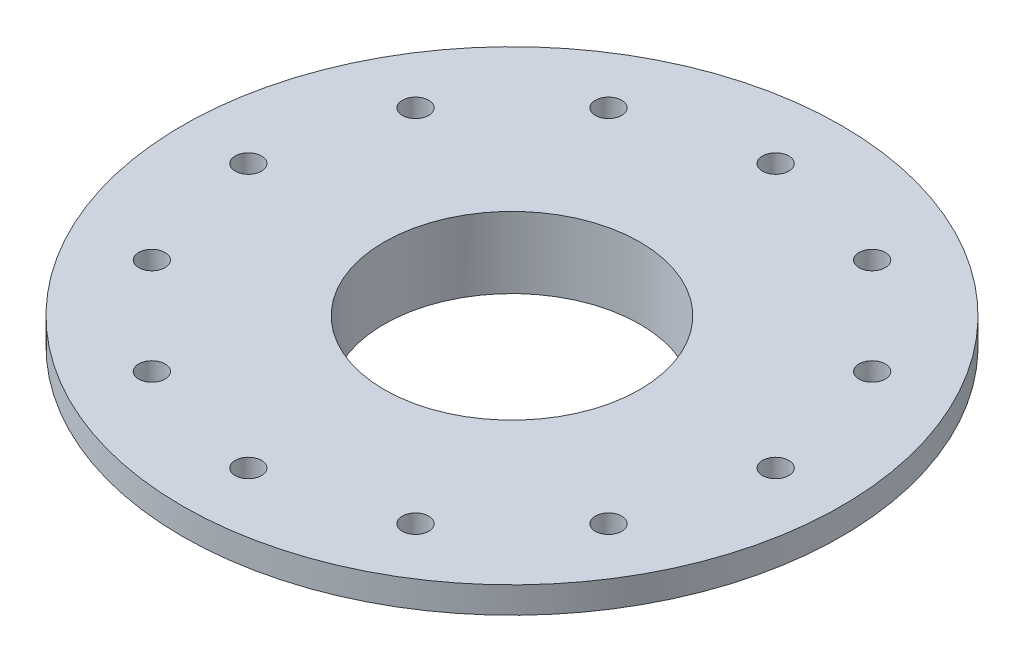
ISO-10303-21;
HEADER;
FILE_DESCRIPTION(('STEP AP214'),'2;1');
FILE_NAME('part.step','',(''),(''),'','','');
FILE_SCHEMA(('AUTOMOTIVE_DESIGN { 1 0 10303 214 1 1 1 1 }'));
ENDSEC;
DATA;
#1=APPLICATION_CONTEXT('core data for automotive mechanical design processes');
#2=APPLICATION_PROTOCOL_DEFINITION('international standard','automotive_design',2000,#1);
#3=PRODUCT_CONTEXT('',#1,'mechanical');
#4=PRODUCT('Part','Part','',(#3));
#5=PRODUCT_RELATED_PRODUCT_CATEGORY('part','',(#4));
#6=PRODUCT_DEFINITION_FORMATION('','',#4);
#7=PRODUCT_DEFINITION_CONTEXT('part definition',#1,'design');
#8=PRODUCT_DEFINITION('design','',#6,#7);
#9=PRODUCT_DEFINITION_SHAPE('','',#8);
#10=(LENGTH_UNIT() NAMED_UNIT(*) SI_UNIT(.MILLI.,.METRE.));
#11=(NAMED_UNIT(*) PLANE_ANGLE_UNIT() SI_UNIT($,.RADIAN.));
#12=(NAMED_UNIT(*) SI_UNIT($,.STERADIAN.) SOLID_ANGLE_UNIT());
#13=UNCERTAINTY_MEASURE_WITH_UNIT(LENGTH_MEASURE(1.E-05),#10,'distance_accuracy_value','');
#14=(GEOMETRIC_REPRESENTATION_CONTEXT(3) GLOBAL_UNCERTAINTY_ASSIGNED_CONTEXT((#13)) GLOBAL_UNIT_ASSIGNED_CONTEXT((#10,
#11,#12)) REPRESENTATION_CONTEXT('',''));
#15=CARTESIAN_POINT('',(0.,0.,0.));
#16=DIRECTION('',(0.,0.,1.));
#17=DIRECTION('',(1.,0.,0.));
#18=AXIS2_PLACEMENT_3D('',#15,#16,#17);
#19=CARTESIAN_POINT('',(0.,10.,0.));
#20=DIRECTION('',(0.,-1.,0.));
#21=DIRECTION('',(0.,0.,-1.));
#22=AXIS2_PLACEMENT_3D('',#19,#20,#21);
#23=CYLINDRICAL_SURFACE('',#22,125.);
#24=CARTESIAN_POINT('',(0.,10.,0.));
#25=DIRECTION('',(0.,1.,0.));
#26=DIRECTION('',(0.,0.,1.));
#27=AXIS2_PLACEMENT_3D('',#24,#25,#26);
#28=CIRCLE('',#27,125.);
#29=CARTESIAN_POINT('',(0.,10.,125.));
#30=VERTEX_POINT('',#29);
#31=EDGE_CURVE('E50',#30,#30,#28,.T.);
#32=ORIENTED_EDGE('',*,*,#31,.F.);
#33=EDGE_LOOP('',(#32));
#34=FACE_BOUND('',#33,.T.);
#35=CARTESIAN_POINT('',(0.,0.,0.));
#36=DIRECTION('',(0.,1.,0.));
#37=DIRECTION('',(0.,0.,1.));
#38=AXIS2_PLACEMENT_3D('',#35,#36,#37);
#39=CIRCLE('',#38,125.);
#40=CARTESIAN_POINT('',(0.,0.,125.));
#41=VERTEX_POINT('',#40);
#42=EDGE_CURVE('E53',#41,#41,#39,.T.);
#43=ORIENTED_EDGE('',*,*,#42,.T.);
#44=EDGE_LOOP('',(#43));
#45=FACE_BOUND('',#44,.T.);
#46=ADVANCED_FACE('F35',(#34,#45),#23,.T.);
#47=CARTESIAN_POINT('',(0.,10.,0.));
#48=DIRECTION('',(0.,1.,0.));
#49=DIRECTION('',(0.,0.,1.));
#50=AXIS2_PLACEMENT_3D('',#47,#48,#49);
#51=PLANE('',#50);
#52=CARTESIAN_POINT('',(0.,10.,0.));
#53=DIRECTION('',(0.,1.,0.));
#54=DIRECTION('',(0.,0.,1.));
#55=AXIS2_PLACEMENT_3D('',#52,#53,#54);
#56=CIRCLE('',#55,48.5);
#57=CARTESIAN_POINT('',(0.,10.,48.5));
#58=VERTEX_POINT('',#57);
#59=EDGE_CURVE('E113',#58,#58,#56,.T.);
#60=ORIENTED_EDGE('',*,*,#59,.F.);
#61=EDGE_LOOP('',(#60));
#62=FACE_BOUND('',#61,.T.);
#63=CARTESIAN_POINT('',(100.,10.,0.));
#64=DIRECTION('',(0.,1.,0.));
#65=DIRECTION('',(0.,0.,1.));
#66=AXIS2_PLACEMENT_3D('',#63,#64,#65);
#67=CIRCLE('',#66,4.99999999999999);
#68=CARTESIAN_POINT('',(100.,10.,4.99999999999999));
#69=VERTEX_POINT('',#68);
#70=EDGE_CURVE('E84',#69,#69,#67,.T.);
#71=ORIENTED_EDGE('',*,*,#70,.F.);
#72=EDGE_LOOP('',(#71));
#73=FACE_BOUND('',#72,.T.);
#74=CARTESIAN_POINT('',(86.6025403784438,10.,-50.0000000000001));
#75=DIRECTION('',(0.,1.,0.));
#76=DIRECTION('',(0.,0.,1.));
#77=AXIS2_PLACEMENT_3D('',#74,#75,#76);
#78=CIRCLE('',#77,4.99999999999999);
#79=CARTESIAN_POINT('',(86.6025403784438,10.,-45.0000000000001));
#80=VERTEX_POINT('',#79);
#81=EDGE_CURVE('E109',#80,#80,#78,.T.);
#82=ORIENTED_EDGE('',*,*,#81,.F.);
#83=EDGE_LOOP('',(#82));
#84=FACE_BOUND('',#83,.T.);
#85=CARTESIAN_POINT('',(49.9999999999999,10.,-86.6025403784439));
#86=DIRECTION('',(0.,1.,0.));
#87=DIRECTION('',(0.,0.,1.));
#88=AXIS2_PLACEMENT_3D('',#85,#86,#87);
#89=CIRCLE('',#88,5.);
#90=CARTESIAN_POINT('',(49.9999999999999,10.,-81.6025403784439));
#91=VERTEX_POINT('',#90);
#92=EDGE_CURVE('E116',#91,#91,#89,.T.);
#93=ORIENTED_EDGE('',*,*,#92,.F.);
#94=EDGE_LOOP('',(#93));
#95=FACE_BOUND('',#94,.T.);
#96=CARTESIAN_POINT('',(0.,10.,-100.));
#97=DIRECTION('',(0.,1.,0.));
#98=DIRECTION('',(0.,0.,1.));
#99=AXIS2_PLACEMENT_3D('',#96,#97,#98);
#100=CIRCLE('',#99,4.99999999999999);
#101=CARTESIAN_POINT('',(0.,10.,-95.));
#102=VERTEX_POINT('',#101);
#103=EDGE_CURVE('E122',#102,#102,#100,.T.);
#104=ORIENTED_EDGE('',*,*,#103,.F.);
#105=EDGE_LOOP('',(#104));
#106=FACE_BOUND('',#105,.T.);
#107=CARTESIAN_POINT('',(86.6025403784439,10.,50.));
#108=DIRECTION('',(0.,1.,0.));
#109=DIRECTION('',(0.,0.,1.));
#110=AXIS2_PLACEMENT_3D('',#107,#108,#109);
#111=CIRCLE('',#110,5.00000000000001);
#112=CARTESIAN_POINT('',(86.6025403784439,10.,55.));
#113=VERTEX_POINT('',#112);
#114=EDGE_CURVE('E78',#113,#113,#111,.T.);
#115=ORIENTED_EDGE('',*,*,#114,.F.);
#116=EDGE_LOOP('',(#115));
#117=FACE_BOUND('',#116,.T.);
#118=CARTESIAN_POINT('',(50.,10.,86.6025403784438));
#119=DIRECTION('',(0.,1.,0.));
#120=DIRECTION('',(0.,0.,1.));
#121=AXIS2_PLACEMENT_3D('',#118,#119,#120);
#122=CIRCLE('',#121,5.00000000000001);
#123=CARTESIAN_POINT('',(50.,10.,91.6025403784439));
#124=VERTEX_POINT('',#123);
#125=EDGE_CURVE('E72',#124,#124,#122,.T.);
#126=ORIENTED_EDGE('',*,*,#125,.F.);
#127=EDGE_LOOP('',(#126));
#128=FACE_BOUND('',#127,.T.);
#129=CARTESIAN_POINT('',(0.,10.,100.));
#130=DIRECTION('',(0.,1.,0.));
#131=DIRECTION('',(0.,0.,1.));
#132=AXIS2_PLACEMENT_3D('',#129,#130,#131);
#133=CIRCLE('',#132,4.99999999999998);
#134=CARTESIAN_POINT('',(0.,10.,105.));
#135=VERTEX_POINT('',#134);
#136=EDGE_CURVE('E66',#135,#135,#133,.T.);
#137=ORIENTED_EDGE('',*,*,#136,.F.);
#138=EDGE_LOOP('',(#137));
#139=FACE_BOUND('',#138,.T.);
#140=CARTESIAN_POINT('',(-50.,10.,86.6025403784439));
#141=DIRECTION('',(0.,1.,0.));
#142=DIRECTION('',(0.,0.,1.));
#143=AXIS2_PLACEMENT_3D('',#140,#141,#142);
#144=CIRCLE('',#143,4.99999999999999);
#145=CARTESIAN_POINT('',(-50.,10.,91.6025403784439));
#146=VERTEX_POINT('',#145);
#147=EDGE_CURVE('E59',#146,#146,#144,.T.);
#148=ORIENTED_EDGE('',*,*,#147,.F.);
#149=EDGE_LOOP('',(#148));
#150=FACE_BOUND('',#149,.T.);
#151=CARTESIAN_POINT('',(-86.6025403784439,10.,50.));
#152=DIRECTION('',(0.,1.,0.));
#153=DIRECTION('',(0.,0.,1.));
#154=AXIS2_PLACEMENT_3D('',#151,#152,#153);
#155=CIRCLE('',#154,4.99999999999999);
#156=CARTESIAN_POINT('',(-86.6025403784439,10.,55.));
#157=VERTEX_POINT('',#156);
#158=EDGE_CURVE('E104',#157,#157,#155,.T.);
#159=ORIENTED_EDGE('',*,*,#158,.F.);
#160=EDGE_LOOP('',(#159));
#161=FACE_BOUND('',#160,.T.);
#162=CARTESIAN_POINT('',(-100.,10.,0.));
#163=DIRECTION('',(0.,1.,0.));
#164=DIRECTION('',(0.,0.,1.));
#165=AXIS2_PLACEMENT_3D('',#162,#163,#164);
#166=CIRCLE('',#165,4.99999999999999);
#167=CARTESIAN_POINT('',(-100.,10.,4.99999999999998));
#168=VERTEX_POINT('',#167);
#169=EDGE_CURVE('E98',#168,#168,#166,.T.);
#170=ORIENTED_EDGE('',*,*,#169,.F.);
#171=EDGE_LOOP('',(#170));
#172=FACE_BOUND('',#171,.T.);
#173=CARTESIAN_POINT('',(-86.6025403784439,10.,-50.));
#174=DIRECTION('',(0.,1.,0.));
#175=DIRECTION('',(0.,0.,1.));
#176=AXIS2_PLACEMENT_3D('',#173,#174,#175);
#177=CIRCLE('',#176,4.99999999999999);
#178=CARTESIAN_POINT('',(-86.6025403784439,10.,-45.));
#179=VERTEX_POINT('',#178);
#180=EDGE_CURVE('E92',#179,#179,#177,.T.);
#181=ORIENTED_EDGE('',*,*,#180,.F.);
#182=EDGE_LOOP('',(#181));
#183=FACE_BOUND('',#182,.T.);
#184=CARTESIAN_POINT('',(-50.,10.,-86.6025403784439));
#185=DIRECTION('',(0.,1.,0.));
#186=DIRECTION('',(0.,0.,1.));
#187=AXIS2_PLACEMENT_3D('',#184,#185,#186);
#188=CIRCLE('',#187,4.99999999999999);
#189=CARTESIAN_POINT('',(-50.,10.,-81.6025403784439));
#190=VERTEX_POINT('',#189);
#191=EDGE_CURVE('E85',#190,#190,#188,.T.);
#192=ORIENTED_EDGE('',*,*,#191,.F.);
#193=EDGE_LOOP('',(#192));
#194=FACE_BOUND('',#193,.T.);
#195=ORIENTED_EDGE('',*,*,#31,.T.);
#196=EDGE_LOOP('',(#195));
#197=FACE_BOUND('',#196,.T.);
#198=ADVANCED_FACE('F156',(#62,#73,#84,#95,#106,#117,#128,#139,#150,#161,#172,#183,#194,#197),
#51,.T.);
#199=CARTESIAN_POINT('',(0.,0.,0.));
#200=DIRECTION('',(0.,1.,0.));
#201=DIRECTION('',(0.,0.,1.));
#202=AXIS2_PLACEMENT_3D('',#199,#200,#201);
#203=PLANE('',#202);
#204=CARTESIAN_POINT('',(0.,0.,0.));
#205=DIRECTION('',(0.,-1.,0.));
#206=DIRECTION('',(0.,0.,-1.));
#207=AXIS2_PLACEMENT_3D('',#204,#205,#206);
#208=CIRCLE('',#207,107.5);
#209=CARTESIAN_POINT('',(0.,0.,-107.5));
#210=VERTEX_POINT('',#209);
#211=EDGE_CURVE('E46',#210,#210,#208,.T.);
#212=ORIENTED_EDGE('',*,*,#211,.F.);
#213=EDGE_LOOP('',(#212));
#214=FACE_BOUND('',#213,.T.);
#215=ORIENTED_EDGE('',*,*,#42,.F.);
#216=EDGE_LOOP('',(#215));
#217=FACE_BOUND('',#216,.T.);
#218=ADVANCED_FACE('F161',(#214,#217),#203,.F.);
#219=CARTESIAN_POINT('',(-50.,0.,-86.6025403784439));
#220=DIRECTION('',(0.,1.,0.));
#221=DIRECTION('',(0.,0.,1.));
#222=AXIS2_PLACEMENT_3D('',#219,#220,#221);
#223=CYLINDRICAL_SURFACE('',#222,4.99999999999999);
#224=CARTESIAN_POINT('',(-50.,0.,-86.6025403784439));
#225=DIRECTION('',(0.,1.,0.));
#226=DIRECTION('',(0.,0.,1.));
#227=AXIS2_PLACEMENT_3D('',#224,#225,#226);
#228=CIRCLE('',#227,4.99999999999999);
#229=CARTESIAN_POINT('',(-50.,0.,-81.6025403784439));
#230=VERTEX_POINT('',#229);
#231=EDGE_CURVE('E88',#230,#230,#228,.T.);
#232=ORIENTED_EDGE('',*,*,#231,.F.);
#233=EDGE_LOOP('',(#232));
#234=FACE_BOUND('',#233,.T.);
#235=ORIENTED_EDGE('',*,*,#191,.T.);
#236=EDGE_LOOP('',(#235));
#237=FACE_BOUND('',#236,.T.);
#238=ADVANCED_FACE('F168',(#234,#237),#223,.F.);
#239=CARTESIAN_POINT('',(-86.6025403784439,0.,-50.));
#240=DIRECTION('',(0.,1.,0.));
#241=DIRECTION('',(0.,0.,1.));
#242=AXIS2_PLACEMENT_3D('',#239,#240,#241);
#243=CYLINDRICAL_SURFACE('',#242,4.99999999999999);
#244=CARTESIAN_POINT('',(-86.6025403784439,0.,-50.));
#245=DIRECTION('',(0.,1.,0.));
#246=DIRECTION('',(0.,0.,1.));
#247=AXIS2_PLACEMENT_3D('',#244,#245,#246);
#248=CIRCLE('',#247,4.99999999999999);
#249=CARTESIAN_POINT('',(-86.6025403784439,0.,-45.));
#250=VERTEX_POINT('',#249);
#251=EDGE_CURVE('E95',#250,#250,#248,.T.);
#252=ORIENTED_EDGE('',*,*,#251,.F.);
#253=EDGE_LOOP('',(#252));
#254=FACE_BOUND('',#253,.T.);
#255=ORIENTED_EDGE('',*,*,#180,.T.);
#256=EDGE_LOOP('',(#255));
#257=FACE_BOUND('',#256,.T.);
#258=ADVANCED_FACE('F191',(#254,#257),#243,.F.);
#259=CARTESIAN_POINT('',(-100.,0.,0.));
#260=DIRECTION('',(0.,1.,0.));
#261=DIRECTION('',(0.,0.,1.));
#262=AXIS2_PLACEMENT_3D('',#259,#260,#261);
#263=CYLINDRICAL_SURFACE('',#262,4.99999999999999);
#264=CARTESIAN_POINT('',(-100.,0.,0.));
#265=DIRECTION('',(0.,1.,0.));
#266=DIRECTION('',(0.,0.,1.));
#267=AXIS2_PLACEMENT_3D('',#264,#265,#266);
#268=CIRCLE('',#267,4.99999999999999);
#269=CARTESIAN_POINT('',(-100.,0.,4.99999999999998));
#270=VERTEX_POINT('',#269);
#271=EDGE_CURVE('E101',#270,#270,#268,.T.);
#272=ORIENTED_EDGE('',*,*,#271,.F.);
#273=EDGE_LOOP('',(#272));
#274=FACE_BOUND('',#273,.T.);
#275=ORIENTED_EDGE('',*,*,#169,.T.);
#276=EDGE_LOOP('',(#275));
#277=FACE_BOUND('',#276,.T.);
#278=ADVANCED_FACE('F195',(#274,#277),#263,.F.);
#279=CARTESIAN_POINT('',(-86.6025403784439,0.,50.));
#280=DIRECTION('',(0.,1.,0.));
#281=DIRECTION('',(0.,0.,1.));
#282=AXIS2_PLACEMENT_3D('',#279,#280,#281);
#283=CYLINDRICAL_SURFACE('',#282,4.99999999999999);
#284=CARTESIAN_POINT('',(-86.6025403784439,0.,50.));
#285=DIRECTION('',(0.,1.,0.));
#286=DIRECTION('',(0.,0.,1.));
#287=AXIS2_PLACEMENT_3D('',#284,#285,#286);
#288=CIRCLE('',#287,4.99999999999999);
#289=CARTESIAN_POINT('',(-86.6025403784439,0.,55.));
#290=VERTEX_POINT('',#289);
#291=EDGE_CURVE('E63',#290,#290,#288,.T.);
#292=ORIENTED_EDGE('',*,*,#291,.F.);
#293=EDGE_LOOP('',(#292));
#294=FACE_BOUND('',#293,.T.);
#295=ORIENTED_EDGE('',*,*,#158,.T.);
#296=EDGE_LOOP('',(#295));
#297=FACE_BOUND('',#296,.T.);
#298=ADVANCED_FACE('F175',(#294,#297),#283,.F.);
#299=CARTESIAN_POINT('',(-50.,0.,86.6025403784439));
#300=DIRECTION('',(0.,1.,0.));
#301=DIRECTION('',(0.,0.,1.));
#302=AXIS2_PLACEMENT_3D('',#299,#300,#301);
#303=CYLINDRICAL_SURFACE('',#302,4.99999999999999);
#304=CARTESIAN_POINT('',(-50.,0.,86.6025403784439));
#305=DIRECTION('',(0.,1.,0.));
#306=DIRECTION('',(0.,0.,1.));
#307=AXIS2_PLACEMENT_3D('',#304,#305,#306);
#308=CIRCLE('',#307,4.99999999999999);
#309=CARTESIAN_POINT('',(-50.,0.,91.6025403784439));
#310=VERTEX_POINT('',#309);
#311=EDGE_CURVE('E62',#310,#310,#308,.T.);
#312=ORIENTED_EDGE('',*,*,#311,.F.);
#313=EDGE_LOOP('',(#312));
#314=FACE_BOUND('',#313,.T.);
#315=ORIENTED_EDGE('',*,*,#147,.T.);
#316=EDGE_LOOP('',(#315));
#317=FACE_BOUND('',#316,.T.);
#318=ADVANCED_FACE('F171',(#314,#317),#303,.F.);
#319=CARTESIAN_POINT('',(0.,0.,100.));
#320=DIRECTION('',(0.,1.,0.));
#321=DIRECTION('',(0.,0.,1.));
#322=AXIS2_PLACEMENT_3D('',#319,#320,#321);
#323=CYLINDRICAL_SURFACE('',#322,4.99999999999998);
#324=CARTESIAN_POINT('',(0.,0.,100.));
#325=DIRECTION('',(0.,1.,0.));
#326=DIRECTION('',(0.,0.,1.));
#327=AXIS2_PLACEMENT_3D('',#324,#325,#326);
#328=CIRCLE('',#327,4.99999999999998);
#329=CARTESIAN_POINT('',(0.,0.,105.));
#330=VERTEX_POINT('',#329);
#331=EDGE_CURVE('E69',#330,#330,#328,.T.);
#332=ORIENTED_EDGE('',*,*,#331,.F.);
#333=EDGE_LOOP('',(#332));
#334=FACE_BOUND('',#333,.T.);
#335=ORIENTED_EDGE('',*,*,#136,.T.);
#336=EDGE_LOOP('',(#335));
#337=FACE_BOUND('',#336,.T.);
#338=ADVANCED_FACE('F174',(#334,#337),#323,.F.);
#339=CARTESIAN_POINT('',(50.,0.,86.6025403784438));
#340=DIRECTION('',(0.,1.,0.));
#341=DIRECTION('',(0.,0.,1.));
#342=AXIS2_PLACEMENT_3D('',#339,#340,#341);
#343=CYLINDRICAL_SURFACE('',#342,5.00000000000001);
#344=CARTESIAN_POINT('',(50.,0.,86.6025403784438));
#345=DIRECTION('',(0.,1.,0.));
#346=DIRECTION('',(0.,0.,1.));
#347=AXIS2_PLACEMENT_3D('',#344,#345,#346);
#348=CIRCLE('',#347,5.00000000000001);
#349=CARTESIAN_POINT('',(50.,0.,91.6025403784439));
#350=VERTEX_POINT('',#349);
#351=EDGE_CURVE('E75',#350,#350,#348,.T.);
#352=ORIENTED_EDGE('',*,*,#351,.F.);
#353=EDGE_LOOP('',(#352));
#354=FACE_BOUND('',#353,.T.);
#355=ORIENTED_EDGE('',*,*,#125,.T.);
#356=EDGE_LOOP('',(#355));
#357=FACE_BOUND('',#356,.T.);
#358=ADVANCED_FACE('F179',(#354,#357),#343,.F.);
#359=CARTESIAN_POINT('',(86.6025403784439,0.,50.));
#360=DIRECTION('',(0.,1.,0.));
#361=DIRECTION('',(0.,0.,1.));
#362=AXIS2_PLACEMENT_3D('',#359,#360,#361);
#363=CYLINDRICAL_SURFACE('',#362,5.00000000000001);
#364=CARTESIAN_POINT('',(86.6025403784439,0.,50.));
#365=DIRECTION('',(0.,1.,0.));
#366=DIRECTION('',(0.,0.,1.));
#367=AXIS2_PLACEMENT_3D('',#364,#365,#366);
#368=CIRCLE('',#367,5.00000000000001);
#369=CARTESIAN_POINT('',(86.6025403784439,0.,55.));
#370=VERTEX_POINT('',#369);
#371=EDGE_CURVE('E81',#370,#370,#368,.T.);
#372=ORIENTED_EDGE('',*,*,#371,.F.);
#373=EDGE_LOOP('',(#372));
#374=FACE_BOUND('',#373,.T.);
#375=ORIENTED_EDGE('',*,*,#114,.T.);
#376=EDGE_LOOP('',(#375));
#377=FACE_BOUND('',#376,.T.);
#378=ADVANCED_FACE('F183',(#374,#377),#363,.F.);
#379=CARTESIAN_POINT('',(0.,0.,-100.));
#380=DIRECTION('',(0.,1.,0.));
#381=DIRECTION('',(0.,0.,1.));
#382=AXIS2_PLACEMENT_3D('',#379,#380,#381);
#383=CYLINDRICAL_SURFACE('',#382,4.99999999999999);
#384=CARTESIAN_POINT('',(0.,0.,-100.));
#385=DIRECTION('',(0.,1.,0.));
#386=DIRECTION('',(0.,0.,1.));
#387=AXIS2_PLACEMENT_3D('',#384,#385,#386);
#388=CIRCLE('',#387,4.99999999999999);
#389=CARTESIAN_POINT('',(0.,0.,-95.));
#390=VERTEX_POINT('',#389);
#391=EDGE_CURVE('E89',#390,#390,#388,.T.);
#392=ORIENTED_EDGE('',*,*,#391,.F.);
#393=EDGE_LOOP('',(#392));
#394=FACE_BOUND('',#393,.T.);
#395=ORIENTED_EDGE('',*,*,#103,.T.);
#396=EDGE_LOOP('',(#395));
#397=FACE_BOUND('',#396,.T.);
#398=ADVANCED_FACE('F187',(#394,#397),#383,.F.);
#399=CARTESIAN_POINT('',(49.9999999999999,0.,-86.6025403784439));
#400=DIRECTION('',(0.,1.,0.));
#401=DIRECTION('',(0.,0.,1.));
#402=AXIS2_PLACEMENT_3D('',#399,#400,#401);
#403=CYLINDRICAL_SURFACE('',#402,5.);
#404=CARTESIAN_POINT('',(49.9999999999999,0.,-86.6025403784439));
#405=DIRECTION('',(0.,1.,0.));
#406=DIRECTION('',(0.,0.,1.));
#407=AXIS2_PLACEMENT_3D('',#404,#405,#406);
#408=CIRCLE('',#407,5.);
#409=CARTESIAN_POINT('',(49.9999999999999,0.,-81.6025403784439));
#410=VERTEX_POINT('',#409);
#411=EDGE_CURVE('E119',#410,#410,#408,.T.);
#412=ORIENTED_EDGE('',*,*,#411,.F.);
#413=EDGE_LOOP('',(#412));
#414=FACE_BOUND('',#413,.T.);
#415=ORIENTED_EDGE('',*,*,#92,.T.);
#416=EDGE_LOOP('',(#415));
#417=FACE_BOUND('',#416,.T.);
#418=ADVANCED_FACE('F205',(#414,#417),#403,.F.);
#419=CARTESIAN_POINT('',(86.6025403784438,0.,-50.0000000000001));
#420=DIRECTION('',(0.,1.,0.));
#421=DIRECTION('',(0.,0.,1.));
#422=AXIS2_PLACEMENT_3D('',#419,#420,#421);
#423=CYLINDRICAL_SURFACE('',#422,4.99999999999999);
#424=CARTESIAN_POINT('',(86.6025403784438,0.,-50.0000000000001));
#425=DIRECTION('',(0.,1.,0.));
#426=DIRECTION('',(0.,0.,1.));
#427=AXIS2_PLACEMENT_3D('',#424,#425,#426);
#428=CIRCLE('',#427,4.99999999999999);
#429=CARTESIAN_POINT('',(86.6025403784438,0.,-45.0000000000001));
#430=VERTEX_POINT('',#429);
#431=EDGE_CURVE('E112',#430,#430,#428,.T.);
#432=ORIENTED_EDGE('',*,*,#431,.F.);
#433=EDGE_LOOP('',(#432));
#434=FACE_BOUND('',#433,.T.);
#435=ORIENTED_EDGE('',*,*,#81,.T.);
#436=EDGE_LOOP('',(#435));
#437=FACE_BOUND('',#436,.T.);
#438=ADVANCED_FACE('F150',(#434,#437),#423,.F.);
#439=CARTESIAN_POINT('',(100.,0.,0.));
#440=DIRECTION('',(0.,1.,0.));
#441=DIRECTION('',(0.,0.,1.));
#442=AXIS2_PLACEMENT_3D('',#439,#440,#441);
#443=CYLINDRICAL_SURFACE('',#442,4.99999999999999);
#444=CARTESIAN_POINT('',(100.,0.,0.));
#445=DIRECTION('',(0.,1.,0.));
#446=DIRECTION('',(0.,0.,1.));
#447=AXIS2_PLACEMENT_3D('',#444,#445,#446);
#448=CIRCLE('',#447,4.99999999999999);
#449=CARTESIAN_POINT('',(100.,0.,4.99999999999999));
#450=VERTEX_POINT('',#449);
#451=EDGE_CURVE('E56',#450,#450,#448,.T.);
#452=ORIENTED_EDGE('',*,*,#451,.F.);
#453=EDGE_LOOP('',(#452));
#454=FACE_BOUND('',#453,.T.);
#455=ORIENTED_EDGE('',*,*,#70,.T.);
#456=EDGE_LOOP('',(#455));
#457=FACE_BOUND('',#456,.T.);
#458=ADVANCED_FACE('F142',(#454,#457),#443,.F.);
#459=CARTESIAN_POINT('',(0.,-17.,0.));
#460=DIRECTION('',(0.,-1.,0.));
#461=DIRECTION('',(0.,0.,-1.));
#462=AXIS2_PLACEMENT_3D('',#459,#460,#461);
#463=PLANE('',#462);
#464=CARTESIAN_POINT('',(0.,-17.,0.));
#465=DIRECTION('',(0.,-1.,0.));
#466=DIRECTION('',(0.,0.,-1.));
#467=AXIS2_PLACEMENT_3D('',#464,#465,#466);
#468=CIRCLE('',#467,48.5);
#469=CARTESIAN_POINT('',(0.,-17.,-48.5));
#470=VERTEX_POINT('',#469);
#471=EDGE_CURVE('E133',#470,#470,#468,.T.);
#472=ORIENTED_EDGE('',*,*,#471,.F.);
#473=EDGE_LOOP('',(#472));
#474=FACE_BOUND('',#473,.T.);
#475=CARTESIAN_POINT('',(0.,-17.,0.));
#476=DIRECTION('',(0.,-1.,0.));
#477=DIRECTION('',(0.,0.,-1.));
#478=AXIS2_PLACEMENT_3D('',#475,#476,#477);
#479=CIRCLE('',#478,97.4999999999999);
#480=CARTESIAN_POINT('',(0.,-17.,-97.4999999999999));
#481=VERTEX_POINT('',#480);
#482=EDGE_CURVE('E42',#481,#481,#479,.T.);
#483=ORIENTED_EDGE('',*,*,#482,.T.);
#484=EDGE_LOOP('',(#483));
#485=FACE_BOUND('',#484,.T.);
#486=ADVANCED_FACE('F139',(#474,#485),#463,.T.);
#487=CARTESIAN_POINT('',(0.,-17.,0.));
#488=DIRECTION('',(0.,1.,0.));
#489=DIRECTION('',(0.,0.,1.));
#490=AXIS2_PLACEMENT_3D('',#487,#488,#489);
#491=CYLINDRICAL_SURFACE('',#490,107.5);
#492=CARTESIAN_POINT('',(0.,-6.99999999999988,0.));
#493=DIRECTION('',(0.,-1.,0.));
#494=DIRECTION('',(0.,0.,-1.));
#495=AXIS2_PLACEMENT_3D('',#492,#493,#494);
#496=CIRCLE('',#495,107.5);
#497=CARTESIAN_POINT('',(0.,-6.99999999999988,-107.5));
#498=VERTEX_POINT('',#497);
#499=EDGE_CURVE('E10',#498,#498,#496,.F.);
#500=ORIENTED_EDGE('',*,*,#499,.T.);
#501=EDGE_LOOP('',(#500));
#502=FACE_BOUND('',#501,.T.);
#503=ORIENTED_EDGE('',*,*,#211,.T.);
#504=EDGE_LOOP('',(#503));
#505=FACE_BOUND('',#504,.T.);
#506=ADVANCED_FACE('F141',(#502,#505),#491,.T.);
#507=CARTESIAN_POINT('',(0.,0.,0.));
#508=DIRECTION('',(0.,-1.,0.));
#509=DIRECTION('',(0.,0.,-1.));
#510=AXIS2_PLACEMENT_3D('',#507,#508,#509);
#511=PLANE('',#510);
#512=ORIENTED_EDGE('',*,*,#231,.T.);
#513=EDGE_LOOP('',(#512));
#514=FACE_BOUND('',#513,.T.);
#515=ADVANCED_FACE('F148',(#514),#511,.F.);
#516=ORIENTED_EDGE('',*,*,#251,.T.);
#517=EDGE_LOOP('',(#516));
#518=FACE_BOUND('',#517,.T.);
#519=ADVANCED_FACE('F224',(#518),#511,.F.);
#520=ORIENTED_EDGE('',*,*,#271,.T.);
#521=EDGE_LOOP('',(#520));
#522=FACE_BOUND('',#521,.T.);
#523=ADVANCED_FACE('F229',(#522),#511,.F.);
#524=ORIENTED_EDGE('',*,*,#291,.T.);
#525=EDGE_LOOP('',(#524));
#526=FACE_BOUND('',#525,.T.);
#527=ADVANCED_FACE('F239',(#526),#511,.F.);
#528=ORIENTED_EDGE('',*,*,#311,.T.);
#529=EDGE_LOOP('',(#528));
#530=FACE_BOUND('',#529,.T.);
#531=ADVANCED_FACE('F248',(#530),#511,.F.);
#532=ORIENTED_EDGE('',*,*,#331,.T.);
#533=EDGE_LOOP('',(#532));
#534=FACE_BOUND('',#533,.T.);
#535=ADVANCED_FACE('F257',(#534),#511,.F.);
#536=ORIENTED_EDGE('',*,*,#351,.T.);
#537=EDGE_LOOP('',(#536));
#538=FACE_BOUND('',#537,.T.);
#539=ADVANCED_FACE('F266',(#538),#511,.F.);
#540=ORIENTED_EDGE('',*,*,#371,.T.);
#541=EDGE_LOOP('',(#540));
#542=FACE_BOUND('',#541,.T.);
#543=ADVANCED_FACE('F275',(#542),#511,.F.);
#544=ORIENTED_EDGE('',*,*,#391,.T.);
#545=EDGE_LOOP('',(#544));
#546=FACE_BOUND('',#545,.T.);
#547=ADVANCED_FACE('F284',(#546),#511,.F.);
#548=ORIENTED_EDGE('',*,*,#411,.T.);
#549=EDGE_LOOP('',(#548));
#550=FACE_BOUND('',#549,.T.);
#551=ADVANCED_FACE('F221',(#550),#511,.F.);
#552=ORIENTED_EDGE('',*,*,#431,.T.);
#553=EDGE_LOOP('',(#552));
#554=FACE_BOUND('',#553,.T.);
#555=ADVANCED_FACE('F214',(#554),#511,.F.);
#556=ORIENTED_EDGE('',*,*,#451,.T.);
#557=EDGE_LOOP('',(#556));
#558=FACE_BOUND('',#557,.T.);
#559=ADVANCED_FACE('F212',(#558),#511,.F.);
#560=CARTESIAN_POINT('',(0.,-17.,0.));
#561=DIRECTION('',(0.,1.,0.));
#562=DIRECTION('',(0.,0.,1.));
#563=AXIS2_PLACEMENT_3D('',#560,#561,#562);
#564=CONICAL_SURFACE('',#563,97.4999999999999,0.785398163397449);
#565=ORIENTED_EDGE('',*,*,#499,.F.);
#566=EDGE_LOOP('',(#565));
#567=FACE_BOUND('',#566,.T.);
#568=ORIENTED_EDGE('',*,*,#482,.F.);
#569=EDGE_LOOP('',(#568));
#570=FACE_BOUND('',#569,.T.);
#571=ADVANCED_FACE('F37',(#567,#570),#564,.T.);
#572=CARTESIAN_POINT('',(0.,40.,0.));
#573=DIRECTION('',(0.,-1.,0.));
#574=DIRECTION('',(0.,0.,-1.));
#575=AXIS2_PLACEMENT_3D('',#572,#573,#574);
#576=CYLINDRICAL_SURFACE('',#575,48.5);
#577=ORIENTED_EDGE('',*,*,#59,.T.);
#578=EDGE_LOOP('',(#577));
#579=FACE_BOUND('',#578,.T.);
#580=ORIENTED_EDGE('',*,*,#471,.T.);
#581=EDGE_LOOP('',(#580));
#582=FACE_BOUND('',#581,.T.);
#583=ADVANCED_FACE('F137',(#579,#582),#576,.F.);
#584=CLOSED_SHELL('',(#46,#198,#218,#238,#258,#278,#298,#318,#338,#358,#378,#398,#418,#438,#458,
#486,#506,#515,#519,#523,#527,#531,#535,#539,#543,#547,#551,#555,#559,#571,#583));
#585=MANIFOLD_SOLID_BREP('B2',#584);
#586=ADVANCED_BREP_SHAPE_REPRESENTATION('',(#18,#585),#14);
#587=SHAPE_DEFINITION_REPRESENTATION(#9,#586);
ENDSEC;
END-ISO-10303-21;
